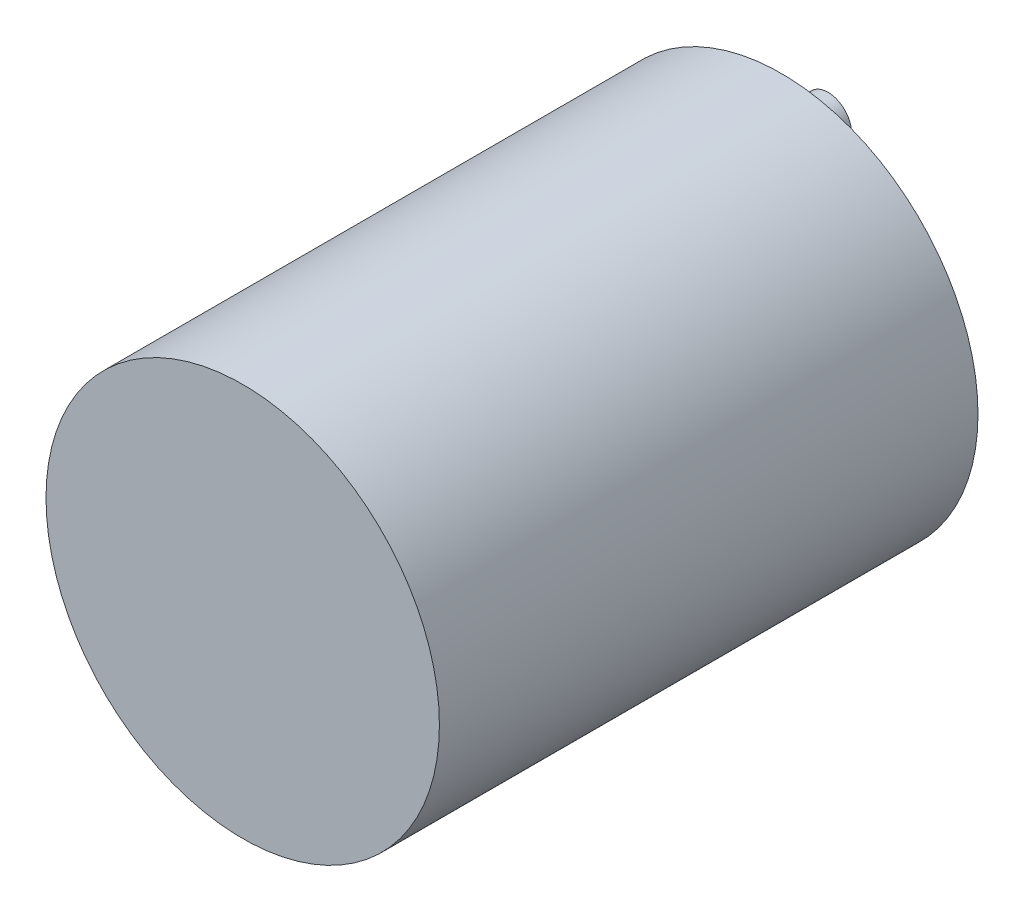
ISO-10303-21;
HEADER;
FILE_DESCRIPTION(('STEP AP214'),'2;1');
FILE_NAME('part.step','',(''),(''),'','','');
FILE_SCHEMA(('AUTOMOTIVE_DESIGN { 1 0 10303 214 1 1 1 1 }'));
ENDSEC;
DATA;
#1=APPLICATION_CONTEXT('core data for automotive mechanical design processes');
#2=APPLICATION_PROTOCOL_DEFINITION('international standard','automotive_design',2000,#1);
#3=PRODUCT_CONTEXT('',#1,'mechanical');
#4=PRODUCT('Part','Part','',(#3));
#5=PRODUCT_RELATED_PRODUCT_CATEGORY('part','',(#4));
#6=PRODUCT_DEFINITION_FORMATION('','',#4);
#7=PRODUCT_DEFINITION_CONTEXT('part definition',#1,'design');
#8=PRODUCT_DEFINITION('design','',#6,#7);
#9=PRODUCT_DEFINITION_SHAPE('','',#8);
#10=(LENGTH_UNIT() NAMED_UNIT(*) SI_UNIT(.MILLI.,.METRE.));
#11=(NAMED_UNIT(*) PLANE_ANGLE_UNIT() SI_UNIT($,.RADIAN.));
#12=(NAMED_UNIT(*) SI_UNIT($,.STERADIAN.) SOLID_ANGLE_UNIT());
#13=UNCERTAINTY_MEASURE_WITH_UNIT(LENGTH_MEASURE(1.E-05),#10,'distance_accuracy_value','');
#14=(GEOMETRIC_REPRESENTATION_CONTEXT(3) GLOBAL_UNCERTAINTY_ASSIGNED_CONTEXT((#13)) GLOBAL_UNIT_ASSIGNED_CONTEXT((#10,
#11,#12)) REPRESENTATION_CONTEXT('',''));
#15=CARTESIAN_POINT('',(0.,0.,0.));
#16=DIRECTION('',(0.,0.,1.));
#17=DIRECTION('',(1.,0.,0.));
#18=AXIS2_PLACEMENT_3D('',#15,#16,#17);
#19=CARTESIAN_POINT('',(0.,0.,57.5));
#20=DIRECTION('',(0.,0.,-1.));
#21=DIRECTION('',(-1.,0.,0.));
#22=AXIS2_PLACEMENT_3D('',#19,#20,#21);
#23=CYLINDRICAL_SURFACE('',#22,21.);
#24=CARTESIAN_POINT('',(0.,0.,57.5));
#25=DIRECTION('',(0.,0.,1.));
#26=DIRECTION('',(1.,0.,0.));
#27=AXIS2_PLACEMENT_3D('',#24,#25,#26);
#28=CIRCLE('',#27,21.);
#29=CARTESIAN_POINT('',(21.,0.,57.5));
#30=VERTEX_POINT('',#29);
#31=EDGE_CURVE('E10',#30,#30,#28,.T.);
#32=ORIENTED_EDGE('',*,*,#31,.F.);
#33=EDGE_LOOP('',(#32));
#34=FACE_BOUND('',#33,.T.);
#35=CARTESIAN_POINT('',(0.,0.,0.));
#36=DIRECTION('',(0.,0.,1.));
#37=DIRECTION('',(1.,0.,0.));
#38=AXIS2_PLACEMENT_3D('',#35,#36,#37);
#39=CIRCLE('',#38,21.);
#40=CARTESIAN_POINT('',(21.,0.,0.));
#41=VERTEX_POINT('',#40);
#42=EDGE_CURVE('E37',#41,#41,#39,.T.);
#43=ORIENTED_EDGE('',*,*,#42,.T.);
#44=EDGE_LOOP('',(#43));
#45=FACE_BOUND('',#44,.T.);
#46=ADVANCED_FACE('F34',(#34,#45),#23,.T.);
#47=CARTESIAN_POINT('',(0.,0.,57.5));
#48=DIRECTION('',(0.,0.,1.));
#49=DIRECTION('',(1.,0.,0.));
#50=AXIS2_PLACEMENT_3D('',#47,#48,#49);
#51=PLANE('',#50);
#52=ORIENTED_EDGE('',*,*,#31,.T.);
#53=EDGE_LOOP('',(#52));
#54=FACE_BOUND('',#53,.T.);
#55=ADVANCED_FACE('F76',(#54),#51,.T.);
#56=CARTESIAN_POINT('',(0.,0.,0.));
#57=DIRECTION('',(0.,0.,1.));
#58=DIRECTION('',(1.,0.,0.));
#59=AXIS2_PLACEMENT_3D('',#56,#57,#58);
#60=PLANE('',#59);
#61=CARTESIAN_POINT('',(-12.3408620039273,-7.12500000000053,0.));
#62=DIRECTION('',(0.,0.,1.));
#63=DIRECTION('',(1.,0.,0.));
#64=AXIS2_PLACEMENT_3D('',#61,#62,#63);
#65=CIRCLE('',#64,2.5);
#66=CARTESIAN_POINT('',(-9.84086200392734,-7.12500000000053,0.));
#67=VERTEX_POINT('',#66);
#68=EDGE_CURVE('E58',#67,#67,#65,.T.);
#69=ORIENTED_EDGE('',*,*,#68,.T.);
#70=EDGE_LOOP('',(#69));
#71=FACE_BOUND('',#70,.T.);
#72=CARTESIAN_POINT('',(12.3408620039292,-7.12499999999948,0.));
#73=DIRECTION('',(0.,0.,1.));
#74=DIRECTION('',(1.,0.,0.));
#75=AXIS2_PLACEMENT_3D('',#72,#73,#74);
#76=CIRCLE('',#75,2.5);
#77=CARTESIAN_POINT('',(14.8408620039292,-7.12499999999948,0.));
#78=VERTEX_POINT('',#77);
#79=EDGE_CURVE('E52',#78,#78,#76,.T.);
#80=ORIENTED_EDGE('',*,*,#79,.T.);
#81=EDGE_LOOP('',(#80));
#82=FACE_BOUND('',#81,.T.);
#83=CARTESIAN_POINT('',(0.,14.25,0.));
#84=DIRECTION('',(0.,0.,1.));
#85=DIRECTION('',(1.,0.,0.));
#86=AXIS2_PLACEMENT_3D('',#83,#84,#85);
#87=CIRCLE('',#86,2.5);
#88=CARTESIAN_POINT('',(2.5,14.25,0.));
#89=VERTEX_POINT('',#88);
#90=EDGE_CURVE('E46',#89,#89,#87,.T.);
#91=ORIENTED_EDGE('',*,*,#90,.T.);
#92=EDGE_LOOP('',(#91));
#93=FACE_BOUND('',#92,.T.);
#94=ORIENTED_EDGE('',*,*,#42,.F.);
#95=EDGE_LOOP('',(#94));
#96=FACE_BOUND('',#95,.T.);
#97=ADVANCED_FACE('F81',(#71,#82,#93,#96),#60,.F.);
#98=CARTESIAN_POINT('',(0.,14.25,-5.));
#99=DIRECTION('',(0.,0.,1.));
#100=DIRECTION('',(1.,0.,0.));
#101=AXIS2_PLACEMENT_3D('',#98,#99,#100);
#102=CYLINDRICAL_SURFACE('',#101,2.5);
#103=CARTESIAN_POINT('',(0.,14.25,-5.));
#104=DIRECTION('',(0.,0.,1.));
#105=DIRECTION('',(1.,0.,0.));
#106=AXIS2_PLACEMENT_3D('',#103,#104,#105);
#107=CIRCLE('',#106,2.5);
#108=CARTESIAN_POINT('',(2.5,14.25,-5.));
#109=VERTEX_POINT('',#108);
#110=EDGE_CURVE('E44',#109,#109,#107,.T.);
#111=ORIENTED_EDGE('',*,*,#110,.T.);
#112=EDGE_LOOP('',(#111));
#113=FACE_BOUND('',#112,.T.);
#114=ORIENTED_EDGE('',*,*,#90,.F.);
#115=EDGE_LOOP('',(#114));
#116=FACE_BOUND('',#115,.T.);
#117=ADVANCED_FACE('F87',(#113,#116),#102,.T.);
#118=CARTESIAN_POINT('',(0.,14.25,-5.));
#119=DIRECTION('',(0.,0.,1.));
#120=DIRECTION('',(1.,0.,0.));
#121=AXIS2_PLACEMENT_3D('',#118,#119,#120);
#122=PLANE('',#121);
#123=ORIENTED_EDGE('',*,*,#110,.F.);
#124=EDGE_LOOP('',(#123));
#125=FACE_BOUND('',#124,.T.);
#126=ADVANCED_FACE('F92',(#125),#122,.F.);
#127=CARTESIAN_POINT('',(12.3408620039292,-7.12499999999948,-5.));
#128=DIRECTION('',(0.,0.,1.));
#129=DIRECTION('',(1.,0.,0.));
#130=AXIS2_PLACEMENT_3D('',#127,#128,#129);
#131=CYLINDRICAL_SURFACE('',#130,2.5);
#132=CARTESIAN_POINT('',(12.3408620039292,-7.12499999999948,-5.));
#133=DIRECTION('',(0.,0.,1.));
#134=DIRECTION('',(1.,0.,0.));
#135=AXIS2_PLACEMENT_3D('',#132,#133,#134);
#136=CIRCLE('',#135,2.5);
#137=CARTESIAN_POINT('',(14.8408620039292,-7.12499999999948,-5.));
#138=VERTEX_POINT('',#137);
#139=EDGE_CURVE('E49',#138,#138,#136,.T.);
#140=ORIENTED_EDGE('',*,*,#139,.T.);
#141=EDGE_LOOP('',(#140));
#142=FACE_BOUND('',#141,.T.);
#143=ORIENTED_EDGE('',*,*,#79,.F.);
#144=EDGE_LOOP('',(#143));
#145=FACE_BOUND('',#144,.T.);
#146=ADVANCED_FACE('F99',(#142,#145),#131,.T.);
#147=CARTESIAN_POINT('',(12.3408620039292,-7.12499999999948,-5.));
#148=DIRECTION('',(0.,0.,1.));
#149=DIRECTION('',(1.,0.,0.));
#150=AXIS2_PLACEMENT_3D('',#147,#148,#149);
#151=PLANE('',#150);
#152=ORIENTED_EDGE('',*,*,#139,.F.);
#153=EDGE_LOOP('',(#152));
#154=FACE_BOUND('',#153,.T.);
#155=ADVANCED_FACE('F73',(#154),#151,.F.);
#156=CARTESIAN_POINT('',(-12.3408620039273,-7.12500000000053,-5.));
#157=DIRECTION('',(0.,0.,1.));
#158=DIRECTION('',(1.,0.,0.));
#159=AXIS2_PLACEMENT_3D('',#156,#157,#158);
#160=CYLINDRICAL_SURFACE('',#159,2.5);
#161=CARTESIAN_POINT('',(-12.3408620039273,-7.12500000000053,-5.));
#162=DIRECTION('',(0.,0.,1.));
#163=DIRECTION('',(1.,0.,0.));
#164=AXIS2_PLACEMENT_3D('',#161,#162,#163);
#165=CIRCLE('',#164,2.5);
#166=CARTESIAN_POINT('',(-9.84086200392734,-7.12500000000053,-5.));
#167=VERTEX_POINT('',#166);
#168=EDGE_CURVE('E55',#167,#167,#165,.T.);
#169=ORIENTED_EDGE('',*,*,#168,.T.);
#170=EDGE_LOOP('',(#169));
#171=FACE_BOUND('',#170,.T.);
#172=ORIENTED_EDGE('',*,*,#68,.F.);
#173=EDGE_LOOP('',(#172));
#174=FACE_BOUND('',#173,.T.);
#175=ADVANCED_FACE('F64',(#171,#174),#160,.T.);
#176=CARTESIAN_POINT('',(-12.3408620039273,-7.12500000000053,-5.));
#177=DIRECTION('',(0.,0.,1.));
#178=DIRECTION('',(1.,0.,0.));
#179=AXIS2_PLACEMENT_3D('',#176,#177,#178);
#180=PLANE('',#179);
#181=ORIENTED_EDGE('',*,*,#168,.F.);
#182=EDGE_LOOP('',(#181));
#183=FACE_BOUND('',#182,.T.);
#184=ADVANCED_FACE('F67',(#183),#180,.F.);
#185=CLOSED_SHELL('',(#46,#55,#97,#117,#126,#146,#155,#175,#184));
#186=MANIFOLD_SOLID_BREP('B2',#185);
#187=ADVANCED_BREP_SHAPE_REPRESENTATION('',(#18,#186),#14);
#188=SHAPE_DEFINITION_REPRESENTATION(#9,#187);
ENDSEC;
END-ISO-10303-21;
